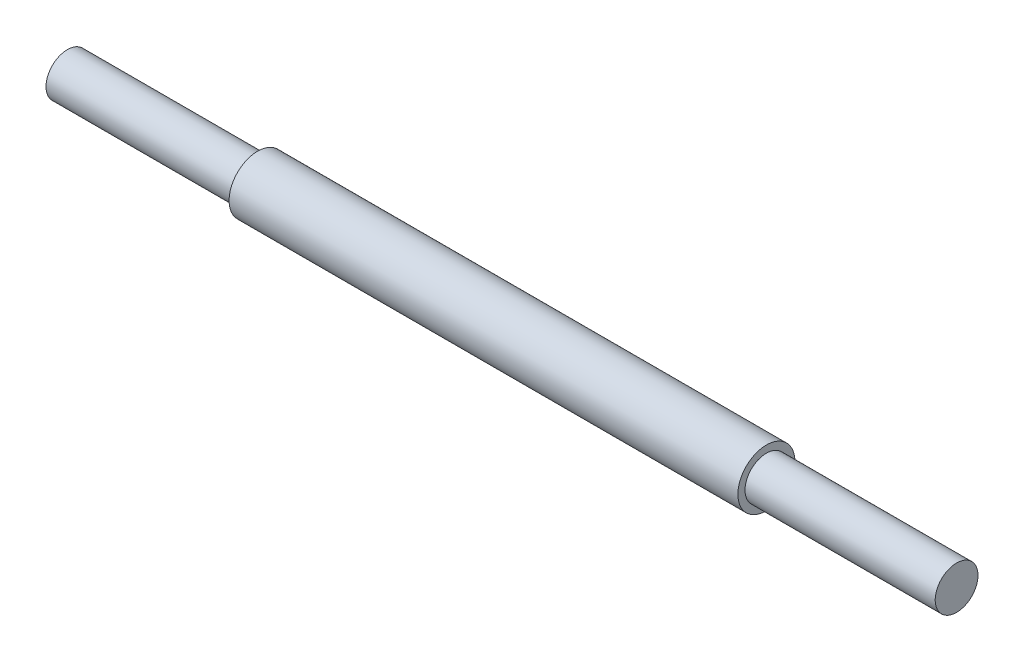
ISO-10303-21;
HEADER;
FILE_DESCRIPTION(('STEP AP214'),'2;1');
FILE_NAME('part.step','',(''),(''),'','','');
FILE_SCHEMA(('AUTOMOTIVE_DESIGN { 1 0 10303 214 1 1 1 1 }'));
ENDSEC;
DATA;
#1=APPLICATION_CONTEXT('core data for automotive mechanical design processes');
#2=APPLICATION_PROTOCOL_DEFINITION('international standard','automotive_design',2000,#1);
#3=PRODUCT_CONTEXT('',#1,'mechanical');
#4=PRODUCT('Part','Part','',(#3));
#5=PRODUCT_RELATED_PRODUCT_CATEGORY('part','',(#4));
#6=PRODUCT_DEFINITION_FORMATION('','',#4);
#7=PRODUCT_DEFINITION_CONTEXT('part definition',#1,'design');
#8=PRODUCT_DEFINITION('design','',#6,#7);
#9=PRODUCT_DEFINITION_SHAPE('','',#8);
#10=(LENGTH_UNIT() NAMED_UNIT(*) SI_UNIT(.MILLI.,.METRE.));
#11=(NAMED_UNIT(*) PLANE_ANGLE_UNIT() SI_UNIT($,.RADIAN.));
#12=(NAMED_UNIT(*) SI_UNIT($,.STERADIAN.) SOLID_ANGLE_UNIT());
#13=UNCERTAINTY_MEASURE_WITH_UNIT(LENGTH_MEASURE(1.E-05),#10,'distance_accuracy_value','');
#14=(GEOMETRIC_REPRESENTATION_CONTEXT(3) GLOBAL_UNCERTAINTY_ASSIGNED_CONTEXT((#13)) GLOBAL_UNIT_ASSIGNED_CONTEXT((#10,
#11,#12)) REPRESENTATION_CONTEXT('',''));
#15=CARTESIAN_POINT('',(0.,0.,0.));
#16=DIRECTION('',(0.,0.,1.));
#17=DIRECTION('',(1.,0.,0.));
#18=AXIS2_PLACEMENT_3D('',#15,#16,#17);
#19=CARTESIAN_POINT('',(214.,7.68596542678854,11.8660518869718));
#20=DIRECTION('',(-1.,0.,0.));
#21=DIRECTION('',(0.,0.,1.));
#22=AXIS2_PLACEMENT_3D('',#19,#20,#21);
#23=CYLINDRICAL_SURFACE('',#22,12.);
#24=CARTESIAN_POINT('',(214.,7.68596542678854,11.8660518869718));
#25=DIRECTION('',(1.,0.,0.));
#26=DIRECTION('',(0.,0.,-1.));
#27=AXIS2_PLACEMENT_3D('',#24,#25,#26);
#28=CIRCLE('',#27,12.);
#29=CARTESIAN_POINT('',(214.,7.68596542678854,-0.13394811302824));
#30=VERTEX_POINT('',#29);
#31=EDGE_CURVE('E42',#30,#30,#28,.T.);
#32=ORIENTED_EDGE('',*,*,#31,.F.);
#33=EDGE_LOOP('',(#32));
#34=FACE_BOUND('',#33,.T.);
#35=CARTESIAN_POINT('',(0.,7.68596542678854,11.8660518869718));
#36=DIRECTION('',(1.,0.,0.));
#37=DIRECTION('',(0.,0.,-1.));
#38=AXIS2_PLACEMENT_3D('',#35,#36,#37);
#39=CIRCLE('',#38,12.);
#40=CARTESIAN_POINT('',(0.,7.68596542678854,-0.13394811302824));
#41=VERTEX_POINT('',#40);
#42=EDGE_CURVE('E33',#41,#41,#39,.T.);
#43=ORIENTED_EDGE('',*,*,#42,.T.);
#44=EDGE_LOOP('',(#43));
#45=FACE_BOUND('',#44,.T.);
#46=ADVANCED_FACE('F30',(#34,#45),#23,.T.);
#47=CARTESIAN_POINT('',(214.,7.68596542678854,11.8660518869718));
#48=DIRECTION('',(1.,0.,0.));
#49=DIRECTION('',(0.,0.,-1.));
#50=AXIS2_PLACEMENT_3D('',#47,#48,#49);
#51=PLANE('',#50);
#52=CARTESIAN_POINT('',(214.,7.68596542678854,11.8660518869718));
#53=DIRECTION('',(1.,0.,0.));
#54=DIRECTION('',(0.,0.,-1.));
#55=AXIS2_PLACEMENT_3D('',#52,#53,#54);
#56=CIRCLE('',#55,9.);
#57=CARTESIAN_POINT('',(214.,7.68596542678854,2.86605188697176));
#58=VERTEX_POINT('',#57);
#59=EDGE_CURVE('E37',#58,#58,#56,.T.);
#60=ORIENTED_EDGE('',*,*,#59,.F.);
#61=EDGE_LOOP('',(#60));
#62=FACE_BOUND('',#61,.T.);
#63=ORIENTED_EDGE('',*,*,#31,.T.);
#64=EDGE_LOOP('',(#63));
#65=FACE_BOUND('',#64,.T.);
#66=ADVANCED_FACE('F59',(#62,#65),#51,.T.);
#67=CARTESIAN_POINT('',(0.,7.68596542678854,11.8660518869718));
#68=DIRECTION('',(1.,0.,0.));
#69=DIRECTION('',(0.,0.,-1.));
#70=AXIS2_PLACEMENT_3D('',#67,#68,#69);
#71=PLANE('',#70);
#72=CARTESIAN_POINT('',(0.,7.68596542678854,11.8660518869718));
#73=DIRECTION('',(-1.,0.,0.));
#74=DIRECTION('',(0.,0.,1.));
#75=AXIS2_PLACEMENT_3D('',#72,#73,#74);
#76=CIRCLE('',#75,9.);
#77=CARTESIAN_POINT('',(0.,7.68596542678854,20.8660518869718));
#78=VERTEX_POINT('',#77);
#79=EDGE_CURVE('E10',#78,#78,#76,.T.);
#80=ORIENTED_EDGE('',*,*,#79,.F.);
#81=EDGE_LOOP('',(#80));
#82=FACE_BOUND('',#81,.T.);
#83=ORIENTED_EDGE('',*,*,#42,.F.);
#84=EDGE_LOOP('',(#83));
#85=FACE_BOUND('',#84,.T.);
#86=ADVANCED_FACE('F56',(#82,#85),#71,.F.);
#87=CARTESIAN_POINT('',(294.,7.68596542678854,11.8660518869718));
#88=DIRECTION('',(-1.,0.,0.));
#89=DIRECTION('',(0.,0.,1.));
#90=AXIS2_PLACEMENT_3D('',#87,#88,#89);
#91=CYLINDRICAL_SURFACE('',#90,9.);
#92=CARTESIAN_POINT('',(294.,7.68596542678854,11.8660518869718));
#93=DIRECTION('',(1.,0.,0.));
#94=DIRECTION('',(0.,0.,-1.));
#95=AXIS2_PLACEMENT_3D('',#92,#93,#94);
#96=CIRCLE('',#95,9.);
#97=CARTESIAN_POINT('',(294.,7.68596542678854,2.86605188697176));
#98=VERTEX_POINT('',#97);
#99=EDGE_CURVE('E47',#98,#98,#96,.T.);
#100=ORIENTED_EDGE('',*,*,#99,.F.);
#101=EDGE_LOOP('',(#100));
#102=FACE_BOUND('',#101,.T.);
#103=ORIENTED_EDGE('',*,*,#59,.T.);
#104=EDGE_LOOP('',(#103));
#105=FACE_BOUND('',#104,.T.);
#106=ADVANCED_FACE('F58',(#102,#105),#91,.T.);
#107=CARTESIAN_POINT('',(294.,7.68596542678854,11.8660518869718));
#108=DIRECTION('',(1.,0.,0.));
#109=DIRECTION('',(0.,0.,-1.));
#110=AXIS2_PLACEMENT_3D('',#107,#108,#109);
#111=PLANE('',#110);
#112=ORIENTED_EDGE('',*,*,#99,.T.);
#113=EDGE_LOOP('',(#112));
#114=FACE_BOUND('',#113,.T.);
#115=ADVANCED_FACE('F65',(#114),#111,.T.);
#116=CARTESIAN_POINT('',(-80.,7.68596542678854,11.8660518869718));
#117=DIRECTION('',(1.,0.,0.));
#118=DIRECTION('',(0.,0.,-1.));
#119=AXIS2_PLACEMENT_3D('',#116,#117,#118);
#120=CYLINDRICAL_SURFACE('',#119,9.);
#121=CARTESIAN_POINT('',(-80.,7.68596542678854,11.8660518869718));
#122=DIRECTION('',(-1.,0.,0.));
#123=DIRECTION('',(0.,0.,1.));
#124=AXIS2_PLACEMENT_3D('',#121,#122,#123);
#125=CIRCLE('',#124,9.);
#126=CARTESIAN_POINT('',(-80.,7.68596542678854,20.8660518869718));
#127=VERTEX_POINT('',#126);
#128=EDGE_CURVE('E46',#127,#127,#125,.T.);
#129=ORIENTED_EDGE('',*,*,#128,.F.);
#130=EDGE_LOOP('',(#129));
#131=FACE_BOUND('',#130,.T.);
#132=ORIENTED_EDGE('',*,*,#79,.T.);
#133=EDGE_LOOP('',(#132));
#134=FACE_BOUND('',#133,.T.);
#135=ADVANCED_FACE('F93',(#131,#134),#120,.T.);
#136=CARTESIAN_POINT('',(-80.,7.68596542678854,11.8660518869718));
#137=DIRECTION('',(-1.,0.,0.));
#138=DIRECTION('',(0.,0.,1.));
#139=AXIS2_PLACEMENT_3D('',#136,#137,#138);
#140=PLANE('',#139);
#141=ORIENTED_EDGE('',*,*,#128,.T.);
#142=EDGE_LOOP('',(#141));
#143=FACE_BOUND('',#142,.T.);
#144=ADVANCED_FACE('F107',(#143),#140,.T.);
#145=CLOSED_SHELL('',(#46,#66,#86,#106,#115,#135,#144));
#146=MANIFOLD_SOLID_BREP('B2',#145);
#147=ADVANCED_BREP_SHAPE_REPRESENTATION('',(#18,#146),#14);
#148=SHAPE_DEFINITION_REPRESENTATION(#9,#147);
ENDSEC;
END-ISO-10303-21;
